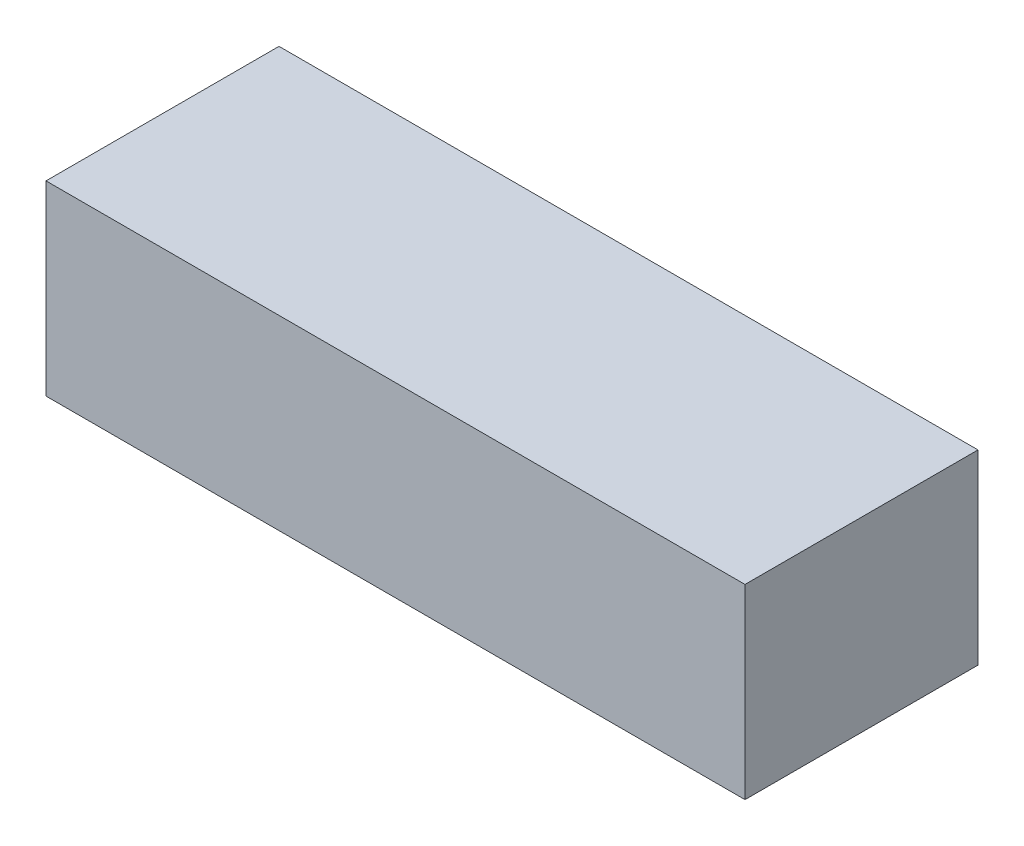
ISO-10303-21;
HEADER;
FILE_DESCRIPTION(('STEP AP214'),'2;1');
FILE_NAME('part.step','',(''),(''),'','','');
FILE_SCHEMA(('AUTOMOTIVE_DESIGN { 1 0 10303 214 1 1 1 1 }'));
ENDSEC;
DATA;
#1=APPLICATION_CONTEXT('core data for automotive mechanical design processes');
#2=APPLICATION_PROTOCOL_DEFINITION('international standard','automotive_design',2000,#1);
#3=PRODUCT_CONTEXT('',#1,'mechanical');
#4=PRODUCT('Part','Part','',(#3));
#5=PRODUCT_RELATED_PRODUCT_CATEGORY('part','',(#4));
#6=PRODUCT_DEFINITION_FORMATION('','',#4);
#7=PRODUCT_DEFINITION_CONTEXT('part definition',#1,'design');
#8=PRODUCT_DEFINITION('design','',#6,#7);
#9=PRODUCT_DEFINITION_SHAPE('','',#8);
#10=(LENGTH_UNIT() NAMED_UNIT(*) SI_UNIT(.MILLI.,.METRE.));
#11=(NAMED_UNIT(*) PLANE_ANGLE_UNIT() SI_UNIT($,.RADIAN.));
#12=(NAMED_UNIT(*) SI_UNIT($,.STERADIAN.) SOLID_ANGLE_UNIT());
#13=UNCERTAINTY_MEASURE_WITH_UNIT(LENGTH_MEASURE(1.E-05),#10,'distance_accuracy_value','');
#14=(GEOMETRIC_REPRESENTATION_CONTEXT(3) GLOBAL_UNCERTAINTY_ASSIGNED_CONTEXT((#13)) GLOBAL_UNIT_ASSIGNED_CONTEXT((#10,
#11,#12)) REPRESENTATION_CONTEXT('',''));
#15=CARTESIAN_POINT('',(0.,0.,0.));
#16=DIRECTION('',(0.,0.,1.));
#17=DIRECTION('',(1.,0.,0.));
#18=AXIS2_PLACEMENT_3D('',#15,#16,#17);
#19=CARTESIAN_POINT('',(0.,0.,10.));
#20=DIRECTION('',(1.,0.,0.));
#21=DIRECTION('',(0.,0.,-1.));
#22=AXIS2_PLACEMENT_3D('',#19,#20,#21);
#23=PLANE('',#22);
#24=DIRECTION('',(0.,-1.,0.));
#25=VECTOR('',#24,1.);
#26=CARTESIAN_POINT('',(0.,0.,0.));
#27=LINE('',#26,#25);
#28=CARTESIAN_POINT('',(0.,8.,0.));
#29=VERTEX_POINT('',#28);
#30=CARTESIAN_POINT('',(0.,0.,0.));
#31=VERTEX_POINT('',#30);
#32=EDGE_CURVE('E98',#29,#31,#27,.T.);
#33=ORIENTED_EDGE('',*,*,#32,.T.);
#34=DIRECTION('',(0.,0.,-1.));
#35=VECTOR('',#34,1.);
#36=CARTESIAN_POINT('',(0.,0.,10.));
#37=LINE('',#36,#35);
#38=CARTESIAN_POINT('',(0.,0.,10.));
#39=VERTEX_POINT('',#38);
#40=EDGE_CURVE('E11',#39,#31,#37,.T.);
#41=ORIENTED_EDGE('',*,*,#40,.F.);
#42=DIRECTION('',(0.,-1.,0.));
#43=VECTOR('',#42,1.);
#44=CARTESIAN_POINT('',(0.,0.,10.));
#45=LINE('',#44,#43);
#46=CARTESIAN_POINT('',(0.,8.,10.));
#47=VERTEX_POINT('',#46);
#48=EDGE_CURVE('E86',#47,#39,#45,.T.);
#49=ORIENTED_EDGE('',*,*,#48,.F.);
#50=DIRECTION('',(0.,0.,-1.));
#51=VECTOR('',#50,1.);
#52=CARTESIAN_POINT('',(0.,8.,10.));
#53=LINE('',#52,#51);
#54=EDGE_CURVE('E94',#47,#29,#53,.T.);
#55=ORIENTED_EDGE('',*,*,#54,.T.);
#56=EDGE_LOOP('',(#33,#41,#49,#55));
#57=FACE_BOUND('',#56,.T.);
#58=ADVANCED_FACE('F35',(#57),#23,.F.);
#59=CARTESIAN_POINT('',(0.,0.,10.));
#60=DIRECTION('',(0.,1.,0.));
#61=DIRECTION('',(0.,0.,1.));
#62=AXIS2_PLACEMENT_3D('',#59,#60,#61);
#63=PLANE('',#62);
#64=DIRECTION('',(1.,0.,0.));
#65=VECTOR('',#64,1.);
#66=CARTESIAN_POINT('',(0.,0.,0.));
#67=LINE('',#66,#65);
#68=CARTESIAN_POINT('',(30.,0.,0.));
#69=VERTEX_POINT('',#68);
#70=EDGE_CURVE('E90',#31,#69,#67,.T.);
#71=ORIENTED_EDGE('',*,*,#70,.T.);
#72=DIRECTION('',(0.,0.,-1.));
#73=VECTOR('',#72,1.);
#74=CARTESIAN_POINT('',(30.,0.,10.));
#75=LINE('',#74,#73);
#76=CARTESIAN_POINT('',(30.,0.,10.));
#77=VERTEX_POINT('',#76);
#78=EDGE_CURVE('E43',#77,#69,#75,.T.);
#79=ORIENTED_EDGE('',*,*,#78,.F.);
#80=DIRECTION('',(1.,0.,0.));
#81=VECTOR('',#80,1.);
#82=CARTESIAN_POINT('',(0.,0.,10.));
#83=LINE('',#82,#81);
#84=EDGE_CURVE('E81',#39,#77,#83,.T.);
#85=ORIENTED_EDGE('',*,*,#84,.F.);
#86=ORIENTED_EDGE('',*,*,#40,.T.);
#87=EDGE_LOOP('',(#71,#79,#85,#86));
#88=FACE_BOUND('',#87,.T.);
#89=ADVANCED_FACE('F89',(#88),#63,.F.);
#90=CARTESIAN_POINT('',(30.,0.,10.));
#91=DIRECTION('',(-1.,0.,0.));
#92=DIRECTION('',(0.,0.,1.));
#93=AXIS2_PLACEMENT_3D('',#90,#91,#92);
#94=PLANE('',#93);
#95=DIRECTION('',(0.,1.,0.));
#96=VECTOR('',#95,1.);
#97=CARTESIAN_POINT('',(30.,0.,0.));
#98=LINE('',#97,#96);
#99=CARTESIAN_POINT('',(30.,8.,0.));
#100=VERTEX_POINT('',#99);
#101=EDGE_CURVE('E68',#69,#100,#98,.T.);
#102=ORIENTED_EDGE('',*,*,#101,.T.);
#103=DIRECTION('',(0.,0.,-1.));
#104=VECTOR('',#103,1.);
#105=CARTESIAN_POINT('',(30.,8.,10.));
#106=LINE('',#105,#104);
#107=CARTESIAN_POINT('',(30.,8.,10.));
#108=VERTEX_POINT('',#107);
#109=EDGE_CURVE('E91',#108,#100,#106,.T.);
#110=ORIENTED_EDGE('',*,*,#109,.F.);
#111=DIRECTION('',(0.,1.,0.));
#112=VECTOR('',#111,1.);
#113=CARTESIAN_POINT('',(30.,0.,10.));
#114=LINE('',#113,#112);
#115=EDGE_CURVE('E84',#77,#108,#114,.T.);
#116=ORIENTED_EDGE('',*,*,#115,.F.);
#117=ORIENTED_EDGE('',*,*,#78,.T.);
#118=EDGE_LOOP('',(#102,#110,#116,#117));
#119=FACE_BOUND('',#118,.T.);
#120=ADVANCED_FACE('F92',(#119),#94,.F.);
#121=CARTESIAN_POINT('',(0.,8.,10.));
#122=DIRECTION('',(0.,-1.,0.));
#123=DIRECTION('',(0.,0.,-1.));
#124=AXIS2_PLACEMENT_3D('',#121,#122,#123);
#125=PLANE('',#124);
#126=DIRECTION('',(-1.,0.,0.));
#127=VECTOR('',#126,1.);
#128=CARTESIAN_POINT('',(0.,8.,0.));
#129=LINE('',#128,#127);
#130=EDGE_CURVE('E74',#100,#29,#129,.T.);
#131=ORIENTED_EDGE('',*,*,#130,.T.);
#132=ORIENTED_EDGE('',*,*,#54,.F.);
#133=DIRECTION('',(-1.,0.,0.));
#134=VECTOR('',#133,1.);
#135=CARTESIAN_POINT('',(0.,8.,10.));
#136=LINE('',#135,#134);
#137=EDGE_CURVE('E51',#108,#47,#136,.T.);
#138=ORIENTED_EDGE('',*,*,#137,.F.);
#139=ORIENTED_EDGE('',*,*,#109,.T.);
#140=EDGE_LOOP('',(#131,#132,#138,#139));
#141=FACE_BOUND('',#140,.T.);
#142=ADVANCED_FACE('F105',(#141),#125,.F.);
#143=CARTESIAN_POINT('',(0.,0.,10.));
#144=DIRECTION('',(0.,0.,-1.));
#145=DIRECTION('',(-1.,0.,0.));
#146=AXIS2_PLACEMENT_3D('',#143,#144,#145);
#147=PLANE('',#146);
#148=ORIENTED_EDGE('',*,*,#48,.T.);
#149=ORIENTED_EDGE('',*,*,#84,.T.);
#150=ORIENTED_EDGE('',*,*,#115,.T.);
#151=ORIENTED_EDGE('',*,*,#137,.T.);
#152=EDGE_LOOP('',(#148,#149,#150,#151));
#153=FACE_BOUND('',#152,.T.);
#154=ADVANCED_FACE('F82',(#153),#147,.F.);
#155=CARTESIAN_POINT('',(0.,0.,0.));
#156=DIRECTION('',(0.,0.,-1.));
#157=DIRECTION('',(-1.,0.,0.));
#158=AXIS2_PLACEMENT_3D('',#155,#156,#157);
#159=PLANE('',#158);
#160=ORIENTED_EDGE('',*,*,#32,.F.);
#161=ORIENTED_EDGE('',*,*,#130,.F.);
#162=ORIENTED_EDGE('',*,*,#101,.F.);
#163=ORIENTED_EDGE('',*,*,#70,.F.);
#164=EDGE_LOOP('',(#160,#161,#162,#163));
#165=FACE_BOUND('',#164,.T.);
#166=ADVANCED_FACE('F108',(#165),#159,.T.);
#167=CLOSED_SHELL('',(#58,#89,#120,#142,#154,#166));
#168=MANIFOLD_SOLID_BREP('B2',#167);
#169=ADVANCED_BREP_SHAPE_REPRESENTATION('',(#18,#168),#14);
#170=SHAPE_DEFINITION_REPRESENTATION(#9,#169);
ENDSEC;
END-ISO-10303-21;
